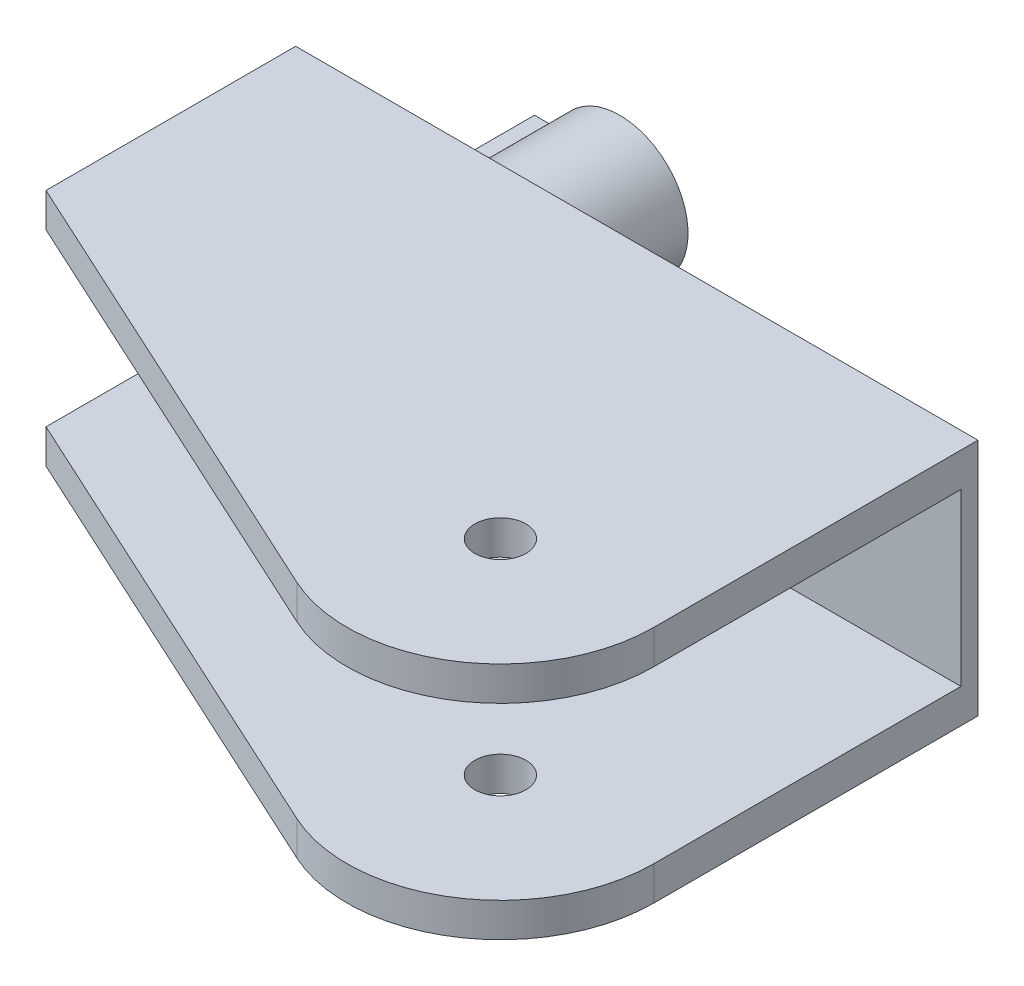
ISO-10303-21;
HEADER;
FILE_DESCRIPTION(('STEP AP214'),'2;1');
FILE_NAME('part.step','',(''),(''),'','','');
FILE_SCHEMA(('AUTOMOTIVE_DESIGN { 1 0 10303 214 1 1 1 1 }'));
ENDSEC;
DATA;
#1=APPLICATION_CONTEXT('core data for automotive mechanical design processes');
#2=APPLICATION_PROTOCOL_DEFINITION('international standard','automotive_design',2000,#1);
#3=PRODUCT_CONTEXT('',#1,'mechanical');
#4=PRODUCT('Part','Part','',(#3));
#5=PRODUCT_RELATED_PRODUCT_CATEGORY('part','',(#4));
#6=PRODUCT_DEFINITION_FORMATION('','',#4);
#7=PRODUCT_DEFINITION_CONTEXT('part definition',#1,'design');
#8=PRODUCT_DEFINITION('design','',#6,#7);
#9=PRODUCT_DEFINITION_SHAPE('','',#8);
#10=(LENGTH_UNIT() NAMED_UNIT(*) SI_UNIT(.MILLI.,.METRE.));
#11=(NAMED_UNIT(*) PLANE_ANGLE_UNIT() SI_UNIT($,.RADIAN.));
#12=(NAMED_UNIT(*) SI_UNIT($,.STERADIAN.) SOLID_ANGLE_UNIT());
#13=UNCERTAINTY_MEASURE_WITH_UNIT(LENGTH_MEASURE(1.E-05),#10,'distance_accuracy_value','');
#14=(GEOMETRIC_REPRESENTATION_CONTEXT(3) GLOBAL_UNCERTAINTY_ASSIGNED_CONTEXT((#13)) GLOBAL_UNIT_ASSIGNED_CONTEXT((#10,
#11,#12)) REPRESENTATION_CONTEXT('',''));
#15=CARTESIAN_POINT('',(0.,0.,0.));
#16=DIRECTION('',(0.,0.,1.));
#17=DIRECTION('',(1.,0.,0.));
#18=AXIS2_PLACEMENT_3D('',#15,#16,#17);
#19=CARTESIAN_POINT('',(-155.,10.,-95.));
#20=DIRECTION('',(0.,0.,1.));
#21=DIRECTION('',(0.,-1.,0.));
#22=AXIS2_PLACEMENT_3D('',#19,#20,#21);
#23=PLANE('',#22);
#24=DIRECTION('',(0.,-1.,0.));
#25=VECTOR('',#24,1.);
#26=CARTESIAN_POINT('',(45.,10.,-95.));
#27=LINE('',#26,#25);
#28=CARTESIAN_POINT('',(45.,10.,-95.));
#29=VERTEX_POINT('',#28);
#30=CARTESIAN_POINT('',(45.,-60.,-95.));
#31=VERTEX_POINT('',#30);
#32=EDGE_CURVE('E219',#29,#31,#27,.T.);
#33=ORIENTED_EDGE('',*,*,#32,.T.);
#34=DIRECTION('',(1.,0.,0.));
#35=VECTOR('',#34,1.);
#36=CARTESIAN_POINT('',(-155.,-60.,-95.));
#37=LINE('',#36,#35);
#38=CARTESIAN_POINT('',(-155.,-60.,-95.));
#39=VERTEX_POINT('',#38);
#40=EDGE_CURVE('E214',#39,#31,#37,.T.);
#41=ORIENTED_EDGE('',*,*,#40,.F.);
#42=DIRECTION('',(0.,-1.,0.));
#43=VECTOR('',#42,1.);
#44=CARTESIAN_POINT('',(-155.,10.,-95.));
#45=LINE('',#44,#43);
#46=CARTESIAN_POINT('',(-155.,10.,-95.));
#47=VERTEX_POINT('',#46);
#48=EDGE_CURVE('E222',#47,#39,#45,.T.);
#49=ORIENTED_EDGE('',*,*,#48,.F.);
#50=DIRECTION('',(1.,0.,0.));
#51=VECTOR('',#50,1.);
#52=CARTESIAN_POINT('',(-155.,10.,-95.));
#53=LINE('',#52,#51);
#54=EDGE_CURVE('E224',#47,#29,#53,.T.);
#55=ORIENTED_EDGE('',*,*,#54,.T.);
#56=EDGE_LOOP('',(#33,#41,#49,#55));
#57=FACE_BOUND('',#56,.T.);
#58=DIRECTION('',(0.,1.,0.));
#59=VECTOR('',#58,1.);
#60=CARTESIAN_POINT('',(-130.,-17.5,-95.));
#61=LINE('',#60,#59);
#62=CARTESIAN_POINT('',(-130.,-32.5,-95.));
#63=VERTEX_POINT('',#62);
#64=CARTESIAN_POINT('',(-130.,-17.5,-95.));
#65=VERTEX_POINT('',#64);
#66=EDGE_CURVE('E59',#63,#65,#61,.T.);
#67=ORIENTED_EDGE('',*,*,#66,.F.);
#68=DIRECTION('',(-1.,0.,0.));
#69=VECTOR('',#68,1.);
#70=CARTESIAN_POINT('',(-123.540496217739,-32.5,-95.));
#71=LINE('',#70,#69);
#72=CARTESIAN_POINT('',(-123.540496217739,-32.5,-95.));
#73=VERTEX_POINT('',#72);
#74=EDGE_CURVE('E65',#73,#63,#71,.T.);
#75=ORIENTED_EDGE('',*,*,#74,.F.);
#76=CARTESIAN_POINT('',(-105.,-25.,-95.));
#77=DIRECTION('',(0.,0.,-1.));
#78=DIRECTION('',(0.,1.,0.));
#79=AXIS2_PLACEMENT_3D('',#76,#77,#78);
#80=CIRCLE('',#79,20.);
#81=CARTESIAN_POINT('',(-123.540496217739,-17.5,-95.));
#82=VERTEX_POINT('',#81);
#83=EDGE_CURVE('E501',#82,#73,#80,.T.);
#84=ORIENTED_EDGE('',*,*,#83,.F.);
#85=DIRECTION('',(1.,0.,0.));
#86=VECTOR('',#85,1.);
#87=CARTESIAN_POINT('',(-123.540496217739,-17.5,-95.));
#88=LINE('',#87,#86);
#89=EDGE_CURVE('E512',#65,#82,#88,.T.);
#90=ORIENTED_EDGE('',*,*,#89,.F.);
#91=EDGE_LOOP('',(#67,#75,#84,#90));
#92=FACE_BOUND('',#91,.T.);
#93=ADVANCED_FACE('F41',(#57,#92),#23,.F.);
#94=CARTESIAN_POINT('',(0.,10.,0.));
#95=DIRECTION('',(0.,-1.,0.));
#96=DIRECTION('',(0.,0.,-1.));
#97=AXIS2_PLACEMENT_3D('',#94,#95,#96);
#98=CYLINDRICAL_SURFACE('',#97,45.);
#99=CARTESIAN_POINT('',(0.,0.,0.));
#100=DIRECTION('',(0.,1.,0.));
#101=DIRECTION('',(0.,0.,1.));
#102=AXIS2_PLACEMENT_3D('',#99,#100,#101);
#103=CIRCLE('',#102,45.);
#104=CARTESIAN_POINT('',(-18.8149850942354,0.,40.8778220543084));
#105=VERTEX_POINT('',#104);
#106=CARTESIAN_POINT('',(45.,0.,0.));
#107=VERTEX_POINT('',#106);
#108=EDGE_CURVE('E199',#105,#107,#103,.T.);
#109=ORIENTED_EDGE('',*,*,#108,.T.);
#110=DIRECTION('',(0.,-1.,0.));
#111=VECTOR('',#110,1.);
#112=CARTESIAN_POINT('',(45.,10.,0.));
#113=LINE('',#112,#111);
#114=CARTESIAN_POINT('',(45.,10.,0.));
#115=VERTEX_POINT('',#114);
#116=EDGE_CURVE('E11',#115,#107,#113,.T.);
#117=ORIENTED_EDGE('',*,*,#116,.F.);
#118=CARTESIAN_POINT('',(0.,10.,0.));
#119=DIRECTION('',(0.,1.,0.));
#120=DIRECTION('',(0.,0.,1.));
#121=AXIS2_PLACEMENT_3D('',#118,#119,#120);
#122=CIRCLE('',#121,45.);
#123=CARTESIAN_POINT('',(-18.8149850942354,10.,40.8778220543084));
#124=VERTEX_POINT('',#123);
#125=EDGE_CURVE('E226',#124,#115,#122,.T.);
#126=ORIENTED_EDGE('',*,*,#125,.F.);
#127=DIRECTION('',(0.,-1.,0.));
#128=VECTOR('',#127,1.);
#129=CARTESIAN_POINT('',(-18.8149850942354,10.,40.8778220543084));
#130=LINE('',#129,#128);
#131=EDGE_CURVE('E238',#124,#105,#130,.T.);
#132=ORIENTED_EDGE('',*,*,#131,.T.);
#133=EDGE_LOOP('',(#109,#117,#126,#132));
#134=FACE_BOUND('',#133,.T.);
#135=ADVANCED_FACE('F277',(#134),#98,.T.);
#136=CARTESIAN_POINT('',(45.,10.,0.));
#137=DIRECTION('',(-1.,0.,0.));
#138=DIRECTION('',(0.,0.,1.));
#139=AXIS2_PLACEMENT_3D('',#136,#137,#138);
#140=PLANE('',#139);
#141=DIRECTION('',(0.,0.,-1.));
#142=VECTOR('',#141,1.);
#143=CARTESIAN_POINT('',(45.,-50.,45.));
#144=LINE('',#143,#142);
#145=CARTESIAN_POINT('',(45.,-50.,0.));
#146=VERTEX_POINT('',#145);
#147=CARTESIAN_POINT('',(45.,-50.,-90.));
#148=VERTEX_POINT('',#147);
#149=EDGE_CURVE('E163',#146,#148,#144,.T.);
#150=ORIENTED_EDGE('',*,*,#149,.F.);
#151=CARTESIAN_POINT('',(45.,-60.,0.));
#152=VERTEX_POINT('',#151);
#153=EDGE_CURVE('E49',#146,#152,#113,.T.);
#154=ORIENTED_EDGE('',*,*,#153,.T.);
#155=DIRECTION('',(0.,0.,-1.));
#156=VECTOR('',#155,1.);
#157=CARTESIAN_POINT('',(45.,-60.,-90.));
#158=LINE('',#157,#156);
#159=EDGE_CURVE('E206',#152,#31,#158,.T.);
#160=ORIENTED_EDGE('',*,*,#159,.T.);
#161=ORIENTED_EDGE('',*,*,#32,.F.);
#162=DIRECTION('',(0.,0.,-1.));
#163=VECTOR('',#162,1.);
#164=CARTESIAN_POINT('',(45.,10.,0.));
#165=LINE('',#164,#163);
#166=EDGE_CURVE('E232',#115,#29,#165,.T.);
#167=ORIENTED_EDGE('',*,*,#166,.F.);
#168=ORIENTED_EDGE('',*,*,#116,.T.);
#169=DIRECTION('',(0.,0.,1.));
#170=VECTOR('',#169,1.);
#171=CARTESIAN_POINT('',(45.,0.,45.));
#172=LINE('',#171,#170);
#173=CARTESIAN_POINT('',(45.,0.,-90.));
#174=VERTEX_POINT('',#173);
#175=EDGE_CURVE('E178',#174,#107,#172,.T.);
#176=ORIENTED_EDGE('',*,*,#175,.F.);
#177=DIRECTION('',(0.,1.,0.));
#178=VECTOR('',#177,1.);
#179=CARTESIAN_POINT('',(45.,0.,-90.));
#180=LINE('',#179,#178);
#181=EDGE_CURVE('E167',#148,#174,#180,.T.);
#182=ORIENTED_EDGE('',*,*,#181,.F.);
#183=EDGE_LOOP('',(#150,#154,#160,#161,#167,#168,#176,#182));
#184=FACE_BOUND('',#183,.T.);
#185=ADVANCED_FACE('F285',(#184),#140,.F.);
#186=CARTESIAN_POINT('',(-155.,10.,-21.8045542744994));
#187=DIRECTION('',(0.418110779871899,0.,-0.908396045651297));
#188=DIRECTION('',(-0.908396045651297,0.,-0.418110779871899));
#189=AXIS2_PLACEMENT_3D('',#186,#187,#188);
#190=PLANE('',#189);
#191=DIRECTION('',(0.,-1.,0.));
#192=VECTOR('',#191,1.);
#193=CARTESIAN_POINT('',(-155.,10.,-21.8045542744994));
#194=LINE('',#193,#192);
#195=CARTESIAN_POINT('',(-155.,10.,-21.8045542744994));
#196=VERTEX_POINT('',#195);
#197=CARTESIAN_POINT('',(-155.,0.,-21.8045542744994));
#198=VERTEX_POINT('',#197);
#199=EDGE_CURVE('E244',#196,#198,#194,.T.);
#200=ORIENTED_EDGE('',*,*,#199,.T.);
#201=DIRECTION('',(0.908396045651297,0.,0.418110779871899));
#202=VECTOR('',#201,1.);
#203=CARTESIAN_POINT('',(-155.,0.,-21.8045542744994));
#204=LINE('',#203,#202);
#205=EDGE_CURVE('E197',#198,#105,#204,.T.);
#206=ORIENTED_EDGE('',*,*,#205,.T.);
#207=ORIENTED_EDGE('',*,*,#131,.F.);
#208=DIRECTION('',(0.908396045651297,0.,0.418110779871899));
#209=VECTOR('',#208,1.);
#210=CARTESIAN_POINT('',(-155.,10.,-21.8045542744994));
#211=LINE('',#210,#209);
#212=EDGE_CURVE('E240',#196,#124,#211,.T.);
#213=ORIENTED_EDGE('',*,*,#212,.F.);
#214=EDGE_LOOP('',(#200,#206,#207,#213));
#215=FACE_BOUND('',#214,.T.);
#216=ADVANCED_FACE('F295',(#215),#190,.F.);
#217=CARTESIAN_POINT('',(0.,10.,0.));
#218=DIRECTION('',(0.,-1.,0.));
#219=DIRECTION('',(0.,0.,-1.));
#220=AXIS2_PLACEMENT_3D('',#217,#218,#219);
#221=CYLINDRICAL_SURFACE('',#220,7.5);
#222=CARTESIAN_POINT('',(0.,0.,0.));
#223=DIRECTION('',(0.,1.,0.));
#224=DIRECTION('',(0.,0.,1.));
#225=AXIS2_PLACEMENT_3D('',#222,#223,#224);
#226=CIRCLE('',#225,7.5);
#227=CARTESIAN_POINT('',(0.,0.,7.5));
#228=VERTEX_POINT('',#227);
#229=EDGE_CURVE('E44',#228,#228,#226,.T.);
#230=ORIENTED_EDGE('',*,*,#229,.F.);
#231=EDGE_LOOP('',(#230));
#232=FACE_BOUND('',#231,.T.);
#233=CARTESIAN_POINT('',(0.,10.,0.));
#234=DIRECTION('',(0.,1.,0.));
#235=DIRECTION('',(0.,0.,1.));
#236=AXIS2_PLACEMENT_3D('',#233,#234,#235);
#237=CIRCLE('',#236,7.5);
#238=CARTESIAN_POINT('',(0.,10.,7.5));
#239=VERTEX_POINT('',#238);
#240=EDGE_CURVE('E230',#239,#239,#237,.T.);
#241=ORIENTED_EDGE('',*,*,#240,.T.);
#242=EDGE_LOOP('',(#241));
#243=FACE_BOUND('',#242,.T.);
#244=ADVANCED_FACE('F256',(#232,#243),#221,.F.);
#245=CARTESIAN_POINT('',(0.,10.,0.));
#246=DIRECTION('',(0.,1.,0.));
#247=DIRECTION('',(0.,0.,1.));
#248=AXIS2_PLACEMENT_3D('',#245,#246,#247);
#249=PLANE('',#248);
#250=ORIENTED_EDGE('',*,*,#125,.T.);
#251=ORIENTED_EDGE('',*,*,#166,.T.);
#252=ORIENTED_EDGE('',*,*,#54,.F.);
#253=DIRECTION('',(0.,0.,1.));
#254=VECTOR('',#253,1.);
#255=CARTESIAN_POINT('',(-155.,10.,-90.));
#256=LINE('',#255,#254);
#257=EDGE_CURVE('E231',#47,#196,#256,.T.);
#258=ORIENTED_EDGE('',*,*,#257,.T.);
#259=ORIENTED_EDGE('',*,*,#212,.T.);
#260=EDGE_LOOP('',(#250,#251,#252,#258,#259));
#261=FACE_BOUND('',#260,.T.);
#262=ORIENTED_EDGE('',*,*,#240,.F.);
#263=EDGE_LOOP('',(#262));
#264=FACE_BOUND('',#263,.T.);
#265=ADVANCED_FACE('F281',(#261,#264),#249,.T.);
#266=ORIENTED_EDGE('',*,*,#153,.F.);
#267=CARTESIAN_POINT('',(0.,-50.,0.));
#268=DIRECTION('',(0.,-1.,0.));
#269=DIRECTION('',(0.,0.,-1.));
#270=AXIS2_PLACEMENT_3D('',#267,#268,#269);
#271=CIRCLE('',#270,45.);
#272=CARTESIAN_POINT('',(-18.8149850942354,-50.,40.8778220543084));
#273=VERTEX_POINT('',#272);
#274=EDGE_CURVE('E191',#146,#273,#271,.T.);
#275=ORIENTED_EDGE('',*,*,#274,.T.);
#276=CARTESIAN_POINT('',(-18.8149850942354,-60.,40.8778220543084));
#277=VERTEX_POINT('',#276);
#278=EDGE_CURVE('E239',#273,#277,#130,.T.);
#279=ORIENTED_EDGE('',*,*,#278,.T.);
#280=CARTESIAN_POINT('',(0.,-60.,0.));
#281=DIRECTION('',(0.,-1.,0.));
#282=DIRECTION('',(0.,0.,-1.));
#283=AXIS2_PLACEMENT_3D('',#280,#281,#282);
#284=CIRCLE('',#283,45.);
#285=EDGE_CURVE('E205',#277,#152,#284,.F.);
#286=ORIENTED_EDGE('',*,*,#285,.T.);
#287=EDGE_LOOP('',(#266,#275,#279,#286));
#288=FACE_BOUND('',#287,.T.);
#289=ADVANCED_FACE('F43',(#288),#98,.T.);
#290=CARTESIAN_POINT('',(-155.,10.,-90.));
#291=DIRECTION('',(1.,0.,0.));
#292=DIRECTION('',(0.,0.,-1.));
#293=AXIS2_PLACEMENT_3D('',#290,#291,#292);
#294=PLANE('',#293);
#295=DIRECTION('',(0.,1.,0.));
#296=VECTOR('',#295,1.);
#297=CARTESIAN_POINT('',(-155.,0.,-90.));
#298=LINE('',#297,#296);
#299=CARTESIAN_POINT('',(-155.,-50.,-90.));
#300=VERTEX_POINT('',#299);
#301=CARTESIAN_POINT('',(-155.,0.,-90.));
#302=VERTEX_POINT('',#301);
#303=EDGE_CURVE('E171',#300,#302,#298,.T.);
#304=ORIENTED_EDGE('',*,*,#303,.T.);
#305=DIRECTION('',(0.,0.,1.));
#306=VECTOR('',#305,1.);
#307=CARTESIAN_POINT('',(-155.,0.,45.));
#308=LINE('',#307,#306);
#309=EDGE_CURVE('E180',#302,#198,#308,.T.);
#310=ORIENTED_EDGE('',*,*,#309,.T.);
#311=ORIENTED_EDGE('',*,*,#199,.F.);
#312=ORIENTED_EDGE('',*,*,#257,.F.);
#313=ORIENTED_EDGE('',*,*,#48,.T.);
#314=DIRECTION('',(0.,0.,-1.));
#315=VECTOR('',#314,1.);
#316=CARTESIAN_POINT('',(-155.,-60.,-90.));
#317=LINE('',#316,#315);
#318=CARTESIAN_POINT('',(-155.,-60.,-21.8045542744994));
#319=VERTEX_POINT('',#318);
#320=EDGE_CURVE('E215',#319,#39,#317,.T.);
#321=ORIENTED_EDGE('',*,*,#320,.F.);
#322=CARTESIAN_POINT('',(-155.,-50.,-21.8045542744994));
#323=VERTEX_POINT('',#322);
#324=EDGE_CURVE('E243',#323,#319,#194,.T.);
#325=ORIENTED_EDGE('',*,*,#324,.F.);
#326=DIRECTION('',(0.,0.,-1.));
#327=VECTOR('',#326,1.);
#328=CARTESIAN_POINT('',(-155.,-50.,45.));
#329=LINE('',#328,#327);
#330=EDGE_CURVE('E175',#323,#300,#329,.T.);
#331=ORIENTED_EDGE('',*,*,#330,.T.);
#332=EDGE_LOOP('',(#304,#310,#311,#312,#313,#321,#325,#331));
#333=FACE_BOUND('',#332,.T.);
#334=ADVANCED_FACE('F286',(#333),#294,.F.);
#335=ORIENTED_EDGE('',*,*,#278,.F.);
#336=DIRECTION('',(-0.908396045651297,0.,-0.418110779871899));
#337=VECTOR('',#336,1.);
#338=CARTESIAN_POINT('',(-155.,-50.,-21.8045542744994));
#339=LINE('',#338,#337);
#340=EDGE_CURVE('E194',#273,#323,#339,.T.);
#341=ORIENTED_EDGE('',*,*,#340,.T.);
#342=ORIENTED_EDGE('',*,*,#324,.T.);
#343=DIRECTION('',(0.908396045651297,0.,0.418110779871899));
#344=VECTOR('',#343,1.);
#345=CARTESIAN_POINT('',(-155.,-60.,-21.8045542744994));
#346=LINE('',#345,#344);
#347=EDGE_CURVE('E210',#319,#277,#346,.T.);
#348=ORIENTED_EDGE('',*,*,#347,.T.);
#349=EDGE_LOOP('',(#335,#341,#342,#348));
#350=FACE_BOUND('',#349,.T.);
#351=ADVANCED_FACE('F258',(#350),#190,.F.);
#352=CARTESIAN_POINT('',(0.,-50.,0.));
#353=DIRECTION('',(0.,-1.,0.));
#354=DIRECTION('',(0.,0.,-1.));
#355=AXIS2_PLACEMENT_3D('',#352,#353,#354);
#356=CIRCLE('',#355,7.5);
#357=CARTESIAN_POINT('',(0.,-50.,-7.5));
#358=VERTEX_POINT('',#357);
#359=EDGE_CURVE('E189',#358,#358,#356,.T.);
#360=ORIENTED_EDGE('',*,*,#359,.F.);
#361=EDGE_LOOP('',(#360));
#362=FACE_BOUND('',#361,.T.);
#363=CARTESIAN_POINT('',(0.,-60.,0.));
#364=DIRECTION('',(0.,-1.,0.));
#365=DIRECTION('',(0.,0.,-1.));
#366=AXIS2_PLACEMENT_3D('',#363,#364,#365);
#367=CIRCLE('',#366,7.5);
#368=CARTESIAN_POINT('',(0.,-60.,-7.5));
#369=VERTEX_POINT('',#368);
#370=EDGE_CURVE('E201',#369,#369,#367,.F.);
#371=ORIENTED_EDGE('',*,*,#370,.F.);
#372=EDGE_LOOP('',(#371));
#373=FACE_BOUND('',#372,.T.);
#374=ADVANCED_FACE('F252',(#362,#373),#221,.F.);
#375=CARTESIAN_POINT('',(-155.,-60.,-90.));
#376=DIRECTION('',(0.,-1.,0.));
#377=DIRECTION('',(0.,0.,-1.));
#378=AXIS2_PLACEMENT_3D('',#375,#376,#377);
#379=PLANE('',#378);
#380=ORIENTED_EDGE('',*,*,#159,.F.);
#381=ORIENTED_EDGE('',*,*,#285,.F.);
#382=ORIENTED_EDGE('',*,*,#347,.F.);
#383=ORIENTED_EDGE('',*,*,#320,.T.);
#384=ORIENTED_EDGE('',*,*,#40,.T.);
#385=EDGE_LOOP('',(#380,#381,#382,#383,#384));
#386=FACE_BOUND('',#385,.T.);
#387=ORIENTED_EDGE('',*,*,#370,.T.);
#388=EDGE_LOOP('',(#387));
#389=FACE_BOUND('',#388,.T.);
#390=ADVANCED_FACE('F254',(#386,#389),#379,.T.);
#391=CARTESIAN_POINT('',(-155.,0.,45.));
#392=DIRECTION('',(0.,1.,0.));
#393=DIRECTION('',(0.,0.,1.));
#394=AXIS2_PLACEMENT_3D('',#391,#392,#393);
#395=PLANE('',#394);
#396=ORIENTED_EDGE('',*,*,#229,.T.);
#397=EDGE_LOOP('',(#396));
#398=FACE_BOUND('',#397,.T.);
#399=ORIENTED_EDGE('',*,*,#108,.F.);
#400=ORIENTED_EDGE('',*,*,#205,.F.);
#401=ORIENTED_EDGE('',*,*,#309,.F.);
#402=DIRECTION('',(1.,0.,0.));
#403=VECTOR('',#402,1.);
#404=CARTESIAN_POINT('',(-155.,0.,-90.));
#405=LINE('',#404,#403);
#406=EDGE_CURVE('E190',#302,#174,#405,.T.);
#407=ORIENTED_EDGE('',*,*,#406,.T.);
#408=ORIENTED_EDGE('',*,*,#175,.T.);
#409=EDGE_LOOP('',(#399,#400,#401,#407,#408));
#410=FACE_BOUND('',#409,.T.);
#411=ADVANCED_FACE('F265',(#398,#410),#395,.F.);
#412=CARTESIAN_POINT('',(-155.,-50.,45.));
#413=DIRECTION('',(0.,-1.,0.));
#414=DIRECTION('',(0.,0.,-1.));
#415=AXIS2_PLACEMENT_3D('',#412,#413,#414);
#416=PLANE('',#415);
#417=ORIENTED_EDGE('',*,*,#359,.T.);
#418=EDGE_LOOP('',(#417));
#419=FACE_BOUND('',#418,.T.);
#420=ORIENTED_EDGE('',*,*,#149,.T.);
#421=DIRECTION('',(1.,0.,0.));
#422=VECTOR('',#421,1.);
#423=CARTESIAN_POINT('',(-155.,-50.,-90.));
#424=LINE('',#423,#422);
#425=EDGE_CURVE('E182',#300,#148,#424,.T.);
#426=ORIENTED_EDGE('',*,*,#425,.F.);
#427=ORIENTED_EDGE('',*,*,#330,.F.);
#428=ORIENTED_EDGE('',*,*,#340,.F.);
#429=ORIENTED_EDGE('',*,*,#274,.F.);
#430=EDGE_LOOP('',(#420,#426,#427,#428,#429));
#431=FACE_BOUND('',#430,.T.);
#432=ADVANCED_FACE('F250',(#419,#431),#416,.F.);
#433=CARTESIAN_POINT('',(-155.,0.,-90.));
#434=DIRECTION('',(0.,0.,-1.));
#435=DIRECTION('',(-1.,0.,0.));
#436=AXIS2_PLACEMENT_3D('',#433,#434,#435);
#437=PLANE('',#436);
#438=ORIENTED_EDGE('',*,*,#181,.T.);
#439=ORIENTED_EDGE('',*,*,#406,.F.);
#440=ORIENTED_EDGE('',*,*,#303,.F.);
#441=ORIENTED_EDGE('',*,*,#425,.T.);
#442=EDGE_LOOP('',(#438,#439,#440,#441));
#443=FACE_BOUND('',#442,.T.);
#444=ADVANCED_FACE('F326',(#443),#437,.F.);
#445=CARTESIAN_POINT('',(-130.,-17.5,-140.));
#446=DIRECTION('',(1.,0.,0.));
#447=DIRECTION('',(0.,0.,-1.));
#448=AXIS2_PLACEMENT_3D('',#445,#446,#447);
#449=PLANE('',#448);
#450=ORIENTED_EDGE('',*,*,#66,.T.);
#451=DIRECTION('',(0.,0.,1.));
#452=VECTOR('',#451,1.);
#453=CARTESIAN_POINT('',(-130.,-17.5,-140.));
#454=LINE('',#453,#452);
#455=CARTESIAN_POINT('',(-130.,-17.5,-140.));
#456=VERTEX_POINT('',#455);
#457=EDGE_CURVE('E150',#456,#65,#454,.T.);
#458=ORIENTED_EDGE('',*,*,#457,.F.);
#459=DIRECTION('',(0.,1.,0.));
#460=VECTOR('',#459,1.);
#461=CARTESIAN_POINT('',(-130.,-17.5,-140.));
#462=LINE('',#461,#460);
#463=CARTESIAN_POINT('',(-130.,-32.5,-140.));
#464=VERTEX_POINT('',#463);
#465=EDGE_CURVE('E153',#464,#456,#462,.T.);
#466=ORIENTED_EDGE('',*,*,#465,.F.);
#467=DIRECTION('',(0.,0.,1.));
#468=VECTOR('',#467,1.);
#469=CARTESIAN_POINT('',(-130.,-32.5,-140.));
#470=LINE('',#469,#468);
#471=EDGE_CURVE('E503',#464,#63,#470,.T.);
#472=ORIENTED_EDGE('',*,*,#471,.T.);
#473=EDGE_LOOP('',(#450,#458,#466,#472));
#474=FACE_BOUND('',#473,.T.);
#475=ADVANCED_FACE('F162',(#474),#449,.F.);
#476=CARTESIAN_POINT('',(-123.540496217739,-17.5,-140.));
#477=DIRECTION('',(0.,-1.,0.));
#478=DIRECTION('',(0.,0.,-1.));
#479=AXIS2_PLACEMENT_3D('',#476,#477,#478);
#480=PLANE('',#479);
#481=ORIENTED_EDGE('',*,*,#89,.T.);
#482=DIRECTION('',(0.,0.,1.));
#483=VECTOR('',#482,1.);
#484=CARTESIAN_POINT('',(-123.540496217739,-17.5,-140.));
#485=LINE('',#484,#483);
#486=CARTESIAN_POINT('',(-123.540496217739,-17.5,-140.));
#487=VERTEX_POINT('',#486);
#488=EDGE_CURVE('E149',#487,#82,#485,.T.);
#489=ORIENTED_EDGE('',*,*,#488,.F.);
#490=DIRECTION('',(1.,0.,0.));
#491=VECTOR('',#490,1.);
#492=CARTESIAN_POINT('',(-123.540496217739,-17.5,-140.));
#493=LINE('',#492,#491);
#494=EDGE_CURVE('E142',#456,#487,#493,.T.);
#495=ORIENTED_EDGE('',*,*,#494,.F.);
#496=ORIENTED_EDGE('',*,*,#457,.T.);
#497=EDGE_LOOP('',(#481,#489,#495,#496));
#498=FACE_BOUND('',#497,.T.);
#499=ADVANCED_FACE('F144',(#498),#480,.F.);
#500=CARTESIAN_POINT('',(-105.,-25.,-140.));
#501=DIRECTION('',(0.,0.,1.));
#502=DIRECTION('',(0.,-1.,0.));
#503=AXIS2_PLACEMENT_3D('',#500,#501,#502);
#504=CYLINDRICAL_SURFACE('',#503,20.);
#505=ORIENTED_EDGE('',*,*,#83,.T.);
#506=DIRECTION('',(0.,0.,1.));
#507=VECTOR('',#506,1.);
#508=CARTESIAN_POINT('',(-123.540496217739,-32.5,-140.));
#509=LINE('',#508,#507);
#510=CARTESIAN_POINT('',(-123.540496217739,-32.5,-140.));
#511=VERTEX_POINT('',#510);
#512=EDGE_CURVE('E169',#511,#73,#509,.T.);
#513=ORIENTED_EDGE('',*,*,#512,.F.);
#514=CARTESIAN_POINT('',(-105.,-25.,-140.));
#515=DIRECTION('',(0.,0.,-1.));
#516=DIRECTION('',(0.,1.,0.));
#517=AXIS2_PLACEMENT_3D('',#514,#515,#516);
#518=CIRCLE('',#517,20.);
#519=EDGE_CURVE('E155',#487,#511,#518,.T.);
#520=ORIENTED_EDGE('',*,*,#519,.F.);
#521=ORIENTED_EDGE('',*,*,#488,.T.);
#522=EDGE_LOOP('',(#505,#513,#520,#521));
#523=FACE_BOUND('',#522,.T.);
#524=ADVANCED_FACE('F333',(#523),#504,.T.);
#525=CARTESIAN_POINT('',(-123.540496217739,-32.5,-140.));
#526=DIRECTION('',(0.,1.,0.));
#527=DIRECTION('',(0.,0.,1.));
#528=AXIS2_PLACEMENT_3D('',#525,#526,#527);
#529=PLANE('',#528);
#530=ORIENTED_EDGE('',*,*,#74,.T.);
#531=ORIENTED_EDGE('',*,*,#471,.F.);
#532=DIRECTION('',(-1.,0.,0.));
#533=VECTOR('',#532,1.);
#534=CARTESIAN_POINT('',(-123.540496217739,-32.5,-140.));
#535=LINE('',#534,#533);
#536=EDGE_CURVE('E158',#511,#464,#535,.T.);
#537=ORIENTED_EDGE('',*,*,#536,.F.);
#538=ORIENTED_EDGE('',*,*,#512,.T.);
#539=EDGE_LOOP('',(#530,#531,#537,#538));
#540=FACE_BOUND('',#539,.T.);
#541=ADVANCED_FACE('F338',(#540),#529,.F.);
#542=CARTESIAN_POINT('',(-105.,-25.,-140.));
#543=DIRECTION('',(0.,0.,-1.));
#544=DIRECTION('',(0.,1.,0.));
#545=AXIS2_PLACEMENT_3D('',#542,#543,#544);
#546=PLANE('',#545);
#547=ORIENTED_EDGE('',*,*,#465,.T.);
#548=ORIENTED_EDGE('',*,*,#494,.T.);
#549=ORIENTED_EDGE('',*,*,#519,.T.);
#550=ORIENTED_EDGE('',*,*,#536,.T.);
#551=EDGE_LOOP('',(#547,#548,#549,#550));
#552=FACE_BOUND('',#551,.T.);
#553=ADVANCED_FACE('F156',(#552),#546,.T.);
#554=CLOSED_SHELL('',(#93,#135,#185,#216,#244,#265,#289,#334,#351,#374,#390,#411,#432,#444,#475,
#499,#524,#541,#553));
#555=MANIFOLD_SOLID_BREP('B2',#554);
#556=ADVANCED_BREP_SHAPE_REPRESENTATION('',(#18,#555),#14);
#557=SHAPE_DEFINITION_REPRESENTATION(#9,#556);
ENDSEC;
END-ISO-10303-21;
